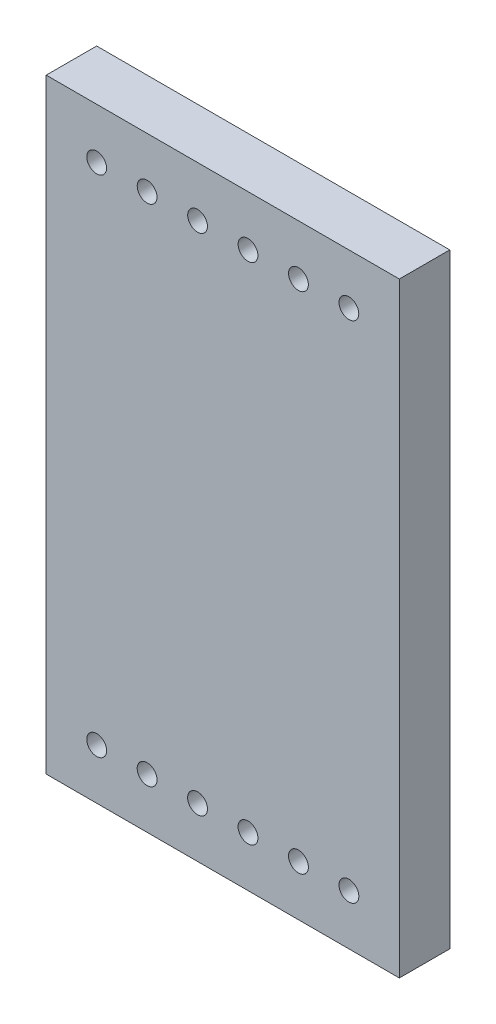
ISO-10303-21;
HEADER;
FILE_DESCRIPTION(('STEP AP214'),'2;1');
FILE_NAME('part.step','',(''),(''),'','','');
FILE_SCHEMA(('AUTOMOTIVE_DESIGN { 1 0 10303 214 1 1 1 1 }'));
ENDSEC;
DATA;
#1=APPLICATION_CONTEXT('core data for automotive mechanical design processes');
#2=APPLICATION_PROTOCOL_DEFINITION('international standard','automotive_design',2000,#1);
#3=PRODUCT_CONTEXT('',#1,'mechanical');
#4=PRODUCT('Part','Part','',(#3));
#5=PRODUCT_RELATED_PRODUCT_CATEGORY('part','',(#4));
#6=PRODUCT_DEFINITION_FORMATION('','',#4);
#7=PRODUCT_DEFINITION_CONTEXT('part definition',#1,'design');
#8=PRODUCT_DEFINITION('design','',#6,#7);
#9=PRODUCT_DEFINITION_SHAPE('','',#8);
#10=(LENGTH_UNIT() NAMED_UNIT(*) SI_UNIT(.MILLI.,.METRE.));
#11=(NAMED_UNIT(*) PLANE_ANGLE_UNIT() SI_UNIT($,.RADIAN.));
#12=(NAMED_UNIT(*) SI_UNIT($,.STERADIAN.) SOLID_ANGLE_UNIT());
#13=UNCERTAINTY_MEASURE_WITH_UNIT(LENGTH_MEASURE(1.E-05),#10,'distance_accuracy_value','');
#14=(GEOMETRIC_REPRESENTATION_CONTEXT(3) GLOBAL_UNCERTAINTY_ASSIGNED_CONTEXT((#13)) GLOBAL_UNIT_ASSIGNED_CONTEXT((#10,
#11,#12)) REPRESENTATION_CONTEXT('',''));
#15=CARTESIAN_POINT('',(0.,0.,0.));
#16=DIRECTION('',(0.,0.,1.));
#17=DIRECTION('',(1.,0.,0.));
#18=AXIS2_PLACEMENT_3D('',#15,#16,#17);
#19=CARTESIAN_POINT('',(0.,0.,12.7));
#20=DIRECTION('',(0.,0.,1.));
#21=DIRECTION('',(1.,0.,0.));
#22=AXIS2_PLACEMENT_3D('',#19,#20,#21);
#23=PLANE('',#22);
#24=CARTESIAN_POINT('',(12.6999999999966,1041.39999999999,12.7));
#25=DIRECTION('',(0.,0.,1.));
#26=DIRECTION('',(1.,0.,0.));
#27=AXIS2_PLACEMENT_3D('',#24,#25,#26);
#28=CIRCLE('',#27,2.49999999999978);
#29=CARTESIAN_POINT('',(15.1999999999964,1041.39999999999,12.7));
#30=VERTEX_POINT('',#29);
#31=EDGE_CURVE('E167',#30,#30,#28,.T.);
#32=ORIENTED_EDGE('',*,*,#31,.F.);
#33=EDGE_LOOP('',(#32));
#34=FACE_BOUND('',#33,.T.);
#35=CARTESIAN_POINT('',(25.3999999999966,1041.39999999999,12.7));
#36=DIRECTION('',(0.,0.,1.));
#37=DIRECTION('',(1.,0.,0.));
#38=AXIS2_PLACEMENT_3D('',#35,#36,#37);
#39=CIRCLE('',#38,2.49999999999978);
#40=CARTESIAN_POINT('',(27.8999999999964,1041.39999999999,12.7));
#41=VERTEX_POINT('',#40);
#42=EDGE_CURVE('E155',#41,#41,#39,.T.);
#43=ORIENTED_EDGE('',*,*,#42,.F.);
#44=EDGE_LOOP('',(#43));
#45=FACE_BOUND('',#44,.T.);
#46=CARTESIAN_POINT('',(38.0999999999966,1041.39999999999,12.7));
#47=DIRECTION('',(0.,0.,1.));
#48=DIRECTION('',(1.,0.,0.));
#49=AXIS2_PLACEMENT_3D('',#46,#47,#48);
#50=CIRCLE('',#49,2.49999999999978);
#51=CARTESIAN_POINT('',(40.5999999999964,1041.39999999999,12.7));
#52=VERTEX_POINT('',#51);
#53=EDGE_CURVE('E143',#52,#52,#50,.T.);
#54=ORIENTED_EDGE('',*,*,#53,.F.);
#55=EDGE_LOOP('',(#54));
#56=FACE_BOUND('',#55,.T.);
#57=CARTESIAN_POINT('',(63.4999999999966,1168.4,12.7));
#58=DIRECTION('',(0.,0.,1.));
#59=DIRECTION('',(1.,0.,0.));
#60=AXIS2_PLACEMENT_3D('',#57,#58,#59);
#61=CIRCLE('',#60,2.48920000000006);
#62=CARTESIAN_POINT('',(65.9891999999966,1168.4,12.7));
#63=VERTEX_POINT('',#62);
#64=EDGE_CURVE('E131',#63,#63,#61,.T.);
#65=ORIENTED_EDGE('',*,*,#64,.F.);
#66=EDGE_LOOP('',(#65));
#67=FACE_BOUND('',#66,.T.);
#68=CARTESIAN_POINT('',(50.7999999999966,1041.39999999999,12.7));
#69=DIRECTION('',(0.,0.,1.));
#70=DIRECTION('',(1.,0.,0.));
#71=AXIS2_PLACEMENT_3D('',#68,#69,#70);
#72=CIRCLE('',#71,2.49999999999978);
#73=CARTESIAN_POINT('',(53.2999999999964,1041.39999999999,12.7));
#74=VERTEX_POINT('',#73);
#75=EDGE_CURVE('E119',#74,#74,#72,.T.);
#76=ORIENTED_EDGE('',*,*,#75,.F.);
#77=EDGE_LOOP('',(#76));
#78=FACE_BOUND('',#77,.T.);
#79=CARTESIAN_POINT('',(76.1999999999967,1041.39999999999,12.7));
#80=DIRECTION('',(0.,0.,1.));
#81=DIRECTION('',(1.,0.,0.));
#82=AXIS2_PLACEMENT_3D('',#79,#80,#81);
#83=CIRCLE('',#82,2.49999999999974);
#84=CARTESIAN_POINT('',(78.6999999999965,1041.39999999999,12.7));
#85=VERTEX_POINT('',#84);
#86=EDGE_CURVE('E98',#85,#85,#83,.T.);
#87=ORIENTED_EDGE('',*,*,#86,.F.);
#88=EDGE_LOOP('',(#87));
#89=FACE_BOUND('',#88,.T.);
#90=DIRECTION('',(0.,1.,0.));
#91=VECTOR('',#90,1.);
#92=CARTESIAN_POINT('',(88.8999999999967,1028.69999999999,12.7));
#93=LINE('',#92,#91);
#94=CARTESIAN_POINT('',(88.8999999999967,1028.69999999999,12.7));
#95=VERTEX_POINT('',#94);
#96=CARTESIAN_POINT('',(88.8999999999967,1181.1,12.7));
#97=VERTEX_POINT('',#96);
#98=EDGE_CURVE('E83',#95,#97,#93,.T.);
#99=ORIENTED_EDGE('',*,*,#98,.T.);
#100=DIRECTION('',(-1.,0.,0.));
#101=VECTOR('',#100,1.);
#102=CARTESIAN_POINT('',(88.8999999999967,1181.1,12.7));
#103=LINE('',#102,#101);
#104=CARTESIAN_POINT('',(0.,1181.1,12.7));
#105=VERTEX_POINT('',#104);
#106=EDGE_CURVE('E78',#97,#105,#103,.T.);
#107=ORIENTED_EDGE('',*,*,#106,.T.);
#108=DIRECTION('',(0.,-1.,0.));
#109=VECTOR('',#108,1.);
#110=CARTESIAN_POINT('',(0.,1028.69999999999,12.7));
#111=LINE('',#110,#109);
#112=CARTESIAN_POINT('',(0.,1028.69999999999,12.7));
#113=VERTEX_POINT('',#112);
#114=EDGE_CURVE('E81',#105,#113,#111,.T.);
#115=ORIENTED_EDGE('',*,*,#114,.T.);
#116=DIRECTION('',(1.,0.,0.));
#117=VECTOR('',#116,1.);
#118=CARTESIAN_POINT('',(88.8999999999967,1028.69999999999,12.7));
#119=LINE('',#118,#117);
#120=EDGE_CURVE('E48',#113,#95,#119,.T.);
#121=ORIENTED_EDGE('',*,*,#120,.T.);
#122=EDGE_LOOP('',(#99,#107,#115,#121));
#123=FACE_BOUND('',#122,.T.);
#124=CARTESIAN_POINT('',(63.4999999999966,1041.39999999999,12.7));
#125=DIRECTION('',(0.,0.,1.));
#126=DIRECTION('',(1.,0.,0.));
#127=AXIS2_PLACEMENT_3D('',#124,#125,#126);
#128=CIRCLE('',#127,2.49999999999966);
#129=CARTESIAN_POINT('',(65.9999999999962,1041.39999999999,12.7));
#130=VERTEX_POINT('',#129);
#131=EDGE_CURVE('E113',#130,#130,#128,.T.);
#132=ORIENTED_EDGE('',*,*,#131,.F.);
#133=EDGE_LOOP('',(#132));
#134=FACE_BOUND('',#133,.T.);
#135=CARTESIAN_POINT('',(76.1999999999966,1168.4,12.7));
#136=DIRECTION('',(0.,0.,1.));
#137=DIRECTION('',(1.,0.,0.));
#138=AXIS2_PLACEMENT_3D('',#135,#136,#137);
#139=CIRCLE('',#138,2.48920000000008);
#140=CARTESIAN_POINT('',(78.6891999999967,1168.4,12.7));
#141=VERTEX_POINT('',#140);
#142=EDGE_CURVE('E125',#141,#141,#139,.T.);
#143=ORIENTED_EDGE('',*,*,#142,.F.);
#144=EDGE_LOOP('',(#143));
#145=FACE_BOUND('',#144,.T.);
#146=CARTESIAN_POINT('',(50.7999999999966,1168.4,12.7));
#147=DIRECTION('',(0.,0.,1.));
#148=DIRECTION('',(1.,0.,0.));
#149=AXIS2_PLACEMENT_3D('',#146,#147,#148);
#150=CIRCLE('',#149,2.48920000000007);
#151=CARTESIAN_POINT('',(53.2891999999967,1168.4,12.7));
#152=VERTEX_POINT('',#151);
#153=EDGE_CURVE('E137',#152,#152,#150,.T.);
#154=ORIENTED_EDGE('',*,*,#153,.F.);
#155=EDGE_LOOP('',(#154));
#156=FACE_BOUND('',#155,.T.);
#157=CARTESIAN_POINT('',(38.0999999999966,1168.4,12.7));
#158=DIRECTION('',(0.,0.,1.));
#159=DIRECTION('',(1.,0.,0.));
#160=AXIS2_PLACEMENT_3D('',#157,#158,#159);
#161=CIRCLE('',#160,2.48920000000008);
#162=CARTESIAN_POINT('',(40.5891999999967,1168.4,12.7));
#163=VERTEX_POINT('',#162);
#164=EDGE_CURVE('E149',#163,#163,#161,.T.);
#165=ORIENTED_EDGE('',*,*,#164,.F.);
#166=EDGE_LOOP('',(#165));
#167=FACE_BOUND('',#166,.T.);
#168=CARTESIAN_POINT('',(25.3999999999966,1168.4,12.7));
#169=DIRECTION('',(0.,0.,1.));
#170=DIRECTION('',(1.,0.,0.));
#171=AXIS2_PLACEMENT_3D('',#168,#169,#170);
#172=CIRCLE('',#171,2.48920000000007);
#173=CARTESIAN_POINT('',(27.8891999999967,1168.4,12.7));
#174=VERTEX_POINT('',#173);
#175=EDGE_CURVE('E161',#174,#174,#172,.T.);
#176=ORIENTED_EDGE('',*,*,#175,.F.);
#177=EDGE_LOOP('',(#176));
#178=FACE_BOUND('',#177,.T.);
#179=CARTESIAN_POINT('',(12.6999999999966,1168.4,12.7));
#180=DIRECTION('',(0.,0.,1.));
#181=DIRECTION('',(1.,0.,0.));
#182=AXIS2_PLACEMENT_3D('',#179,#180,#181);
#183=CIRCLE('',#182,2.48920000000007);
#184=CARTESIAN_POINT('',(15.1891999999967,1168.4,12.7));
#185=VERTEX_POINT('',#184);
#186=EDGE_CURVE('E173',#185,#185,#183,.T.);
#187=ORIENTED_EDGE('',*,*,#186,.F.);
#188=EDGE_LOOP('',(#187));
#189=FACE_BOUND('',#188,.T.);
#190=ADVANCED_FACE('F31',(#34,#45,#56,#67,#78,#89,#123,#134,#145,#156,#167,#178,#189),#23,.T.);
#191=CARTESIAN_POINT('',(0.,0.,0.));
#192=DIRECTION('',(0.,0.,1.));
#193=DIRECTION('',(1.,0.,0.));
#194=AXIS2_PLACEMENT_3D('',#191,#192,#193);
#195=PLANE('',#194);
#196=DIRECTION('',(0.,1.,0.));
#197=VECTOR('',#196,1.);
#198=CARTESIAN_POINT('',(88.8999999999967,1028.69999999999,0.));
#199=LINE('',#198,#197);
#200=CARTESIAN_POINT('',(88.8999999999967,1028.69999999999,0.));
#201=VERTEX_POINT('',#200);
#202=CARTESIAN_POINT('',(88.8999999999967,1181.1,0.));
#203=VERTEX_POINT('',#202);
#204=EDGE_CURVE('E95',#201,#203,#199,.T.);
#205=ORIENTED_EDGE('',*,*,#204,.F.);
#206=DIRECTION('',(1.,0.,0.));
#207=VECTOR('',#206,1.);
#208=CARTESIAN_POINT('',(88.8999999999967,1028.69999999999,0.));
#209=LINE('',#208,#207);
#210=CARTESIAN_POINT('',(0.,1028.69999999999,0.));
#211=VERTEX_POINT('',#210);
#212=EDGE_CURVE('E71',#211,#201,#209,.T.);
#213=ORIENTED_EDGE('',*,*,#212,.F.);
#214=DIRECTION('',(0.,-1.,0.));
#215=VECTOR('',#214,1.);
#216=CARTESIAN_POINT('',(0.,1028.69999999999,0.));
#217=LINE('',#216,#215);
#218=CARTESIAN_POINT('',(0.,1181.1,0.));
#219=VERTEX_POINT('',#218);
#220=EDGE_CURVE('E65',#219,#211,#217,.T.);
#221=ORIENTED_EDGE('',*,*,#220,.F.);
#222=DIRECTION('',(-1.,0.,0.));
#223=VECTOR('',#222,1.);
#224=CARTESIAN_POINT('',(88.8999999999967,1181.1,0.));
#225=LINE('',#224,#223);
#226=EDGE_CURVE('E87',#203,#219,#225,.T.);
#227=ORIENTED_EDGE('',*,*,#226,.F.);
#228=EDGE_LOOP('',(#205,#213,#221,#227));
#229=FACE_BOUND('',#228,.T.);
#230=CARTESIAN_POINT('',(76.1999999999967,1041.39999999999,0.));
#231=DIRECTION('',(0.,0.,1.));
#232=DIRECTION('',(1.,0.,0.));
#233=AXIS2_PLACEMENT_3D('',#230,#231,#232);
#234=CIRCLE('',#233,2.49999999999974);
#235=CARTESIAN_POINT('',(78.6999999999965,1041.39999999999,0.));
#236=VERTEX_POINT('',#235);
#237=EDGE_CURVE('E110',#236,#236,#234,.T.);
#238=ORIENTED_EDGE('',*,*,#237,.T.);
#239=EDGE_LOOP('',(#238));
#240=FACE_BOUND('',#239,.T.);
#241=CARTESIAN_POINT('',(63.4999999999966,1041.39999999999,0.));
#242=DIRECTION('',(0.,0.,1.));
#243=DIRECTION('',(1.,0.,0.));
#244=AXIS2_PLACEMENT_3D('',#241,#242,#243);
#245=CIRCLE('',#244,2.49999999999966);
#246=CARTESIAN_POINT('',(65.9999999999962,1041.39999999999,0.));
#247=VERTEX_POINT('',#246);
#248=EDGE_CURVE('E116',#247,#247,#245,.T.);
#249=ORIENTED_EDGE('',*,*,#248,.T.);
#250=EDGE_LOOP('',(#249));
#251=FACE_BOUND('',#250,.T.);
#252=CARTESIAN_POINT('',(50.7999999999966,1041.39999999999,0.));
#253=DIRECTION('',(0.,0.,1.));
#254=DIRECTION('',(1.,0.,0.));
#255=AXIS2_PLACEMENT_3D('',#252,#253,#254);
#256=CIRCLE('',#255,2.49999999999978);
#257=CARTESIAN_POINT('',(53.2999999999964,1041.39999999999,0.));
#258=VERTEX_POINT('',#257);
#259=EDGE_CURVE('E122',#258,#258,#256,.T.);
#260=ORIENTED_EDGE('',*,*,#259,.T.);
#261=EDGE_LOOP('',(#260));
#262=FACE_BOUND('',#261,.T.);
#263=CARTESIAN_POINT('',(76.1999999999966,1168.4,0.));
#264=DIRECTION('',(0.,0.,1.));
#265=DIRECTION('',(1.,0.,0.));
#266=AXIS2_PLACEMENT_3D('',#263,#264,#265);
#267=CIRCLE('',#266,2.48920000000008);
#268=CARTESIAN_POINT('',(78.6891999999967,1168.4,0.));
#269=VERTEX_POINT('',#268);
#270=EDGE_CURVE('E128',#269,#269,#267,.T.);
#271=ORIENTED_EDGE('',*,*,#270,.T.);
#272=EDGE_LOOP('',(#271));
#273=FACE_BOUND('',#272,.T.);
#274=CARTESIAN_POINT('',(63.4999999999966,1168.4,0.));
#275=DIRECTION('',(0.,0.,1.));
#276=DIRECTION('',(1.,0.,0.));
#277=AXIS2_PLACEMENT_3D('',#274,#275,#276);
#278=CIRCLE('',#277,2.48920000000006);
#279=CARTESIAN_POINT('',(65.9891999999966,1168.4,0.));
#280=VERTEX_POINT('',#279);
#281=EDGE_CURVE('E134',#280,#280,#278,.T.);
#282=ORIENTED_EDGE('',*,*,#281,.T.);
#283=EDGE_LOOP('',(#282));
#284=FACE_BOUND('',#283,.T.);
#285=CARTESIAN_POINT('',(50.7999999999966,1168.4,0.));
#286=DIRECTION('',(0.,0.,1.));
#287=DIRECTION('',(1.,0.,0.));
#288=AXIS2_PLACEMENT_3D('',#285,#286,#287);
#289=CIRCLE('',#288,2.48920000000007);
#290=CARTESIAN_POINT('',(53.2891999999967,1168.4,0.));
#291=VERTEX_POINT('',#290);
#292=EDGE_CURVE('E140',#291,#291,#289,.T.);
#293=ORIENTED_EDGE('',*,*,#292,.T.);
#294=EDGE_LOOP('',(#293));
#295=FACE_BOUND('',#294,.T.);
#296=CARTESIAN_POINT('',(38.0999999999966,1041.39999999999,0.));
#297=DIRECTION('',(0.,0.,1.));
#298=DIRECTION('',(1.,0.,0.));
#299=AXIS2_PLACEMENT_3D('',#296,#297,#298);
#300=CIRCLE('',#299,2.49999999999978);
#301=CARTESIAN_POINT('',(40.5999999999964,1041.39999999999,0.));
#302=VERTEX_POINT('',#301);
#303=EDGE_CURVE('E146',#302,#302,#300,.T.);
#304=ORIENTED_EDGE('',*,*,#303,.T.);
#305=EDGE_LOOP('',(#304));
#306=FACE_BOUND('',#305,.T.);
#307=CARTESIAN_POINT('',(38.0999999999966,1168.4,0.));
#308=DIRECTION('',(0.,0.,1.));
#309=DIRECTION('',(1.,0.,0.));
#310=AXIS2_PLACEMENT_3D('',#307,#308,#309);
#311=CIRCLE('',#310,2.48920000000008);
#312=CARTESIAN_POINT('',(40.5891999999967,1168.4,0.));
#313=VERTEX_POINT('',#312);
#314=EDGE_CURVE('E152',#313,#313,#311,.T.);
#315=ORIENTED_EDGE('',*,*,#314,.T.);
#316=EDGE_LOOP('',(#315));
#317=FACE_BOUND('',#316,.T.);
#318=CARTESIAN_POINT('',(25.3999999999966,1041.39999999999,0.));
#319=DIRECTION('',(0.,0.,1.));
#320=DIRECTION('',(1.,0.,0.));
#321=AXIS2_PLACEMENT_3D('',#318,#319,#320);
#322=CIRCLE('',#321,2.49999999999978);
#323=CARTESIAN_POINT('',(27.8999999999964,1041.39999999999,0.));
#324=VERTEX_POINT('',#323);
#325=EDGE_CURVE('E158',#324,#324,#322,.T.);
#326=ORIENTED_EDGE('',*,*,#325,.T.);
#327=EDGE_LOOP('',(#326));
#328=FACE_BOUND('',#327,.T.);
#329=CARTESIAN_POINT('',(25.3999999999966,1168.4,0.));
#330=DIRECTION('',(0.,0.,1.));
#331=DIRECTION('',(1.,0.,0.));
#332=AXIS2_PLACEMENT_3D('',#329,#330,#331);
#333=CIRCLE('',#332,2.48920000000007);
#334=CARTESIAN_POINT('',(27.8891999999967,1168.4,0.));
#335=VERTEX_POINT('',#334);
#336=EDGE_CURVE('E164',#335,#335,#333,.T.);
#337=ORIENTED_EDGE('',*,*,#336,.T.);
#338=EDGE_LOOP('',(#337));
#339=FACE_BOUND('',#338,.T.);
#340=CARTESIAN_POINT('',(12.6999999999966,1041.39999999999,0.));
#341=DIRECTION('',(0.,0.,1.));
#342=DIRECTION('',(1.,0.,0.));
#343=AXIS2_PLACEMENT_3D('',#340,#341,#342);
#344=CIRCLE('',#343,2.49999999999978);
#345=CARTESIAN_POINT('',(15.1999999999964,1041.39999999999,0.));
#346=VERTEX_POINT('',#345);
#347=EDGE_CURVE('E170',#346,#346,#344,.T.);
#348=ORIENTED_EDGE('',*,*,#347,.T.);
#349=EDGE_LOOP('',(#348));
#350=FACE_BOUND('',#349,.T.);
#351=CARTESIAN_POINT('',(12.6999999999966,1168.4,0.));
#352=DIRECTION('',(0.,0.,1.));
#353=DIRECTION('',(1.,0.,0.));
#354=AXIS2_PLACEMENT_3D('',#351,#352,#353);
#355=CIRCLE('',#354,2.48920000000007);
#356=CARTESIAN_POINT('',(15.1891999999967,1168.4,0.));
#357=VERTEX_POINT('',#356);
#358=EDGE_CURVE('E176',#357,#357,#355,.T.);
#359=ORIENTED_EDGE('',*,*,#358,.T.);
#360=EDGE_LOOP('',(#359));
#361=FACE_BOUND('',#360,.T.);
#362=ADVANCED_FACE('F106',(#229,#240,#251,#262,#273,#284,#295,#306,#317,#328,#339,#350,#361),
#195,.F.);
#363=CARTESIAN_POINT('',(88.8999999999967,1028.69999999999,12.7));
#364=DIRECTION('',(-1.,0.,0.));
#365=DIRECTION('',(0.,0.,1.));
#366=AXIS2_PLACEMENT_3D('',#363,#364,#365);
#367=PLANE('',#366);
#368=ORIENTED_EDGE('',*,*,#204,.T.);
#369=DIRECTION('',(0.,0.,-1.));
#370=VECTOR('',#369,1.);
#371=CARTESIAN_POINT('',(88.8999999999967,1181.1,12.7));
#372=LINE('',#371,#370);
#373=EDGE_CURVE('E11',#97,#203,#372,.T.);
#374=ORIENTED_EDGE('',*,*,#373,.F.);
#375=ORIENTED_EDGE('',*,*,#98,.F.);
#376=DIRECTION('',(0.,0.,-1.));
#377=VECTOR('',#376,1.);
#378=CARTESIAN_POINT('',(88.8999999999967,1028.69999999999,12.7));
#379=LINE('',#378,#377);
#380=EDGE_CURVE('E91',#95,#201,#379,.T.);
#381=ORIENTED_EDGE('',*,*,#380,.T.);
#382=EDGE_LOOP('',(#368,#374,#375,#381));
#383=FACE_BOUND('',#382,.T.);
#384=ADVANCED_FACE('F33',(#383),#367,.F.);
#385=CARTESIAN_POINT('',(88.8999999999967,1181.1,12.7));
#386=DIRECTION('',(0.,-1.,0.));
#387=DIRECTION('',(0.,0.,-1.));
#388=AXIS2_PLACEMENT_3D('',#385,#386,#387);
#389=PLANE('',#388);
#390=ORIENTED_EDGE('',*,*,#226,.T.);
#391=DIRECTION('',(0.,0.,-1.));
#392=VECTOR('',#391,1.);
#393=CARTESIAN_POINT('',(0.,1181.1,12.7));
#394=LINE('',#393,#392);
#395=EDGE_CURVE('E40',#105,#219,#394,.T.);
#396=ORIENTED_EDGE('',*,*,#395,.F.);
#397=ORIENTED_EDGE('',*,*,#106,.F.);
#398=ORIENTED_EDGE('',*,*,#373,.T.);
#399=EDGE_LOOP('',(#390,#396,#397,#398));
#400=FACE_BOUND('',#399,.T.);
#401=ADVANCED_FACE('F86',(#400),#389,.F.);
#402=CARTESIAN_POINT('',(0.,1028.69999999999,12.7));
#403=DIRECTION('',(1.,0.,0.));
#404=DIRECTION('',(0.,1.,0.));
#405=AXIS2_PLACEMENT_3D('',#402,#403,#404);
#406=PLANE('',#405);
#407=ORIENTED_EDGE('',*,*,#220,.T.);
#408=DIRECTION('',(0.,0.,-1.));
#409=VECTOR('',#408,1.);
#410=CARTESIAN_POINT('',(0.,1028.69999999999,12.7));
#411=LINE('',#410,#409);
#412=EDGE_CURVE('E88',#113,#211,#411,.T.);
#413=ORIENTED_EDGE('',*,*,#412,.F.);
#414=ORIENTED_EDGE('',*,*,#114,.F.);
#415=ORIENTED_EDGE('',*,*,#395,.T.);
#416=EDGE_LOOP('',(#407,#413,#414,#415));
#417=FACE_BOUND('',#416,.T.);
#418=ADVANCED_FACE('F89',(#417),#406,.F.);
#419=CARTESIAN_POINT('',(88.8999999999967,1028.69999999999,12.7));
#420=DIRECTION('',(0.,1.,0.));
#421=DIRECTION('',(0.,0.,1.));
#422=AXIS2_PLACEMENT_3D('',#419,#420,#421);
#423=PLANE('',#422);
#424=ORIENTED_EDGE('',*,*,#212,.T.);
#425=ORIENTED_EDGE('',*,*,#380,.F.);
#426=ORIENTED_EDGE('',*,*,#120,.F.);
#427=ORIENTED_EDGE('',*,*,#412,.T.);
#428=EDGE_LOOP('',(#424,#425,#426,#427));
#429=FACE_BOUND('',#428,.T.);
#430=ADVANCED_FACE('F103',(#429),#423,.F.);
#431=CARTESIAN_POINT('',(76.1999999999967,1041.39999999999,12.7));
#432=DIRECTION('',(0.,0.,-1.));
#433=DIRECTION('',(-1.,0.,0.));
#434=AXIS2_PLACEMENT_3D('',#431,#432,#433);
#435=CYLINDRICAL_SURFACE('',#434,2.49999999999974);
#436=ORIENTED_EDGE('',*,*,#86,.T.);
#437=EDGE_LOOP('',(#436));
#438=FACE_BOUND('',#437,.T.);
#439=ORIENTED_EDGE('',*,*,#237,.F.);
#440=EDGE_LOOP('',(#439));
#441=FACE_BOUND('',#440,.T.);
#442=ADVANCED_FACE('F195',(#438,#441),#435,.F.);
#443=CARTESIAN_POINT('',(63.4999999999966,1041.39999999999,12.7));
#444=DIRECTION('',(0.,0.,-1.));
#445=DIRECTION('',(-1.,0.,0.));
#446=AXIS2_PLACEMENT_3D('',#443,#444,#445);
#447=CYLINDRICAL_SURFACE('',#446,2.49999999999966);
#448=ORIENTED_EDGE('',*,*,#131,.T.);
#449=EDGE_LOOP('',(#448));
#450=FACE_BOUND('',#449,.T.);
#451=ORIENTED_EDGE('',*,*,#248,.F.);
#452=EDGE_LOOP('',(#451));
#453=FACE_BOUND('',#452,.T.);
#454=ADVANCED_FACE('F241',(#450,#453),#447,.F.);
#455=CARTESIAN_POINT('',(50.7999999999966,1041.39999999999,12.7));
#456=DIRECTION('',(0.,0.,-1.));
#457=DIRECTION('',(-1.,0.,0.));
#458=AXIS2_PLACEMENT_3D('',#455,#456,#457);
#459=CYLINDRICAL_SURFACE('',#458,2.49999999999978);
#460=ORIENTED_EDGE('',*,*,#75,.T.);
#461=EDGE_LOOP('',(#460));
#462=FACE_BOUND('',#461,.T.);
#463=ORIENTED_EDGE('',*,*,#259,.F.);
#464=EDGE_LOOP('',(#463));
#465=FACE_BOUND('',#464,.T.);
#466=ADVANCED_FACE('F249',(#462,#465),#459,.F.);
#467=CARTESIAN_POINT('',(76.1999999999966,1168.4,12.7));
#468=DIRECTION('',(0.,0.,-1.));
#469=DIRECTION('',(-1.,0.,0.));
#470=AXIS2_PLACEMENT_3D('',#467,#468,#469);
#471=CYLINDRICAL_SURFACE('',#470,2.48920000000008);
#472=ORIENTED_EDGE('',*,*,#142,.T.);
#473=EDGE_LOOP('',(#472));
#474=FACE_BOUND('',#473,.T.);
#475=ORIENTED_EDGE('',*,*,#270,.F.);
#476=EDGE_LOOP('',(#475));
#477=FACE_BOUND('',#476,.T.);
#478=ADVANCED_FACE('F257',(#474,#477),#471,.F.);
#479=CARTESIAN_POINT('',(63.4999999999966,1168.4,12.7));
#480=DIRECTION('',(0.,0.,-1.));
#481=DIRECTION('',(-1.,0.,0.));
#482=AXIS2_PLACEMENT_3D('',#479,#480,#481);
#483=CYLINDRICAL_SURFACE('',#482,2.48920000000006);
#484=ORIENTED_EDGE('',*,*,#64,.T.);
#485=EDGE_LOOP('',(#484));
#486=FACE_BOUND('',#485,.T.);
#487=ORIENTED_EDGE('',*,*,#281,.F.);
#488=EDGE_LOOP('',(#487));
#489=FACE_BOUND('',#488,.T.);
#490=ADVANCED_FACE('F266',(#486,#489),#483,.F.);
#491=CARTESIAN_POINT('',(50.7999999999966,1168.4,12.7));
#492=DIRECTION('',(0.,0.,-1.));
#493=DIRECTION('',(-1.,0.,0.));
#494=AXIS2_PLACEMENT_3D('',#491,#492,#493);
#495=CYLINDRICAL_SURFACE('',#494,2.48920000000007);
#496=ORIENTED_EDGE('',*,*,#153,.T.);
#497=EDGE_LOOP('',(#496));
#498=FACE_BOUND('',#497,.T.);
#499=ORIENTED_EDGE('',*,*,#292,.F.);
#500=EDGE_LOOP('',(#499));
#501=FACE_BOUND('',#500,.T.);
#502=ADVANCED_FACE('F275',(#498,#501),#495,.F.);
#503=CARTESIAN_POINT('',(38.0999999999966,1041.39999999999,12.7));
#504=DIRECTION('',(0.,0.,-1.));
#505=DIRECTION('',(-1.,0.,0.));
#506=AXIS2_PLACEMENT_3D('',#503,#504,#505);
#507=CYLINDRICAL_SURFACE('',#506,2.49999999999978);
#508=ORIENTED_EDGE('',*,*,#53,.T.);
#509=EDGE_LOOP('',(#508));
#510=FACE_BOUND('',#509,.T.);
#511=ORIENTED_EDGE('',*,*,#303,.F.);
#512=EDGE_LOOP('',(#511));
#513=FACE_BOUND('',#512,.T.);
#514=ADVANCED_FACE('F284',(#510,#513),#507,.F.);
#515=CARTESIAN_POINT('',(38.0999999999966,1168.4,12.7));
#516=DIRECTION('',(0.,0.,-1.));
#517=DIRECTION('',(-1.,0.,0.));
#518=AXIS2_PLACEMENT_3D('',#515,#516,#517);
#519=CYLINDRICAL_SURFACE('',#518,2.48920000000008);
#520=ORIENTED_EDGE('',*,*,#164,.T.);
#521=EDGE_LOOP('',(#520));
#522=FACE_BOUND('',#521,.T.);
#523=ORIENTED_EDGE('',*,*,#314,.F.);
#524=EDGE_LOOP('',(#523));
#525=FACE_BOUND('',#524,.T.);
#526=ADVANCED_FACE('F293',(#522,#525),#519,.F.);
#527=CARTESIAN_POINT('',(25.3999999999966,1041.39999999999,12.7));
#528=DIRECTION('',(0.,0.,-1.));
#529=DIRECTION('',(-1.,0.,0.));
#530=AXIS2_PLACEMENT_3D('',#527,#528,#529);
#531=CYLINDRICAL_SURFACE('',#530,2.49999999999978);
#532=ORIENTED_EDGE('',*,*,#42,.T.);
#533=EDGE_LOOP('',(#532));
#534=FACE_BOUND('',#533,.T.);
#535=ORIENTED_EDGE('',*,*,#325,.F.);
#536=EDGE_LOOP('',(#535));
#537=FACE_BOUND('',#536,.T.);
#538=ADVANCED_FACE('F302',(#534,#537),#531,.F.);
#539=CARTESIAN_POINT('',(25.3999999999966,1168.4,12.7));
#540=DIRECTION('',(0.,0.,-1.));
#541=DIRECTION('',(-1.,0.,0.));
#542=AXIS2_PLACEMENT_3D('',#539,#540,#541);
#543=CYLINDRICAL_SURFACE('',#542,2.48920000000007);
#544=ORIENTED_EDGE('',*,*,#175,.T.);
#545=EDGE_LOOP('',(#544));
#546=FACE_BOUND('',#545,.T.);
#547=ORIENTED_EDGE('',*,*,#336,.F.);
#548=EDGE_LOOP('',(#547));
#549=FACE_BOUND('',#548,.T.);
#550=ADVANCED_FACE('F311',(#546,#549),#543,.F.);
#551=CARTESIAN_POINT('',(12.6999999999966,1041.39999999999,12.7));
#552=DIRECTION('',(0.,0.,-1.));
#553=DIRECTION('',(-1.,0.,0.));
#554=AXIS2_PLACEMENT_3D('',#551,#552,#553);
#555=CYLINDRICAL_SURFACE('',#554,2.49999999999978);
#556=ORIENTED_EDGE('',*,*,#31,.T.);
#557=EDGE_LOOP('',(#556));
#558=FACE_BOUND('',#557,.T.);
#559=ORIENTED_EDGE('',*,*,#347,.F.);
#560=EDGE_LOOP('',(#559));
#561=FACE_BOUND('',#560,.T.);
#562=ADVANCED_FACE('F320',(#558,#561),#555,.F.);
#563=CARTESIAN_POINT('',(12.6999999999966,1168.4,12.7));
#564=DIRECTION('',(0.,0.,-1.));
#565=DIRECTION('',(-1.,0.,0.));
#566=AXIS2_PLACEMENT_3D('',#563,#564,#565);
#567=CYLINDRICAL_SURFACE('',#566,2.48920000000007);
#568=ORIENTED_EDGE('',*,*,#186,.T.);
#569=EDGE_LOOP('',(#568));
#570=FACE_BOUND('',#569,.T.);
#571=ORIENTED_EDGE('',*,*,#358,.F.);
#572=EDGE_LOOP('',(#571));
#573=FACE_BOUND('',#572,.T.);
#574=ADVANCED_FACE('F182',(#570,#573),#567,.F.);
#575=CLOSED_SHELL('',(#190,#362,#384,#401,#418,#430,#442,#454,#466,#478,#490,#502,#514,#526,
#538,#550,#562,#574));
#576=MANIFOLD_SOLID_BREP('B2',#575);
#577=ADVANCED_BREP_SHAPE_REPRESENTATION('',(#18,#576),#14);
#578=SHAPE_DEFINITION_REPRESENTATION(#9,#577);
ENDSEC;
END-ISO-10303-21;
